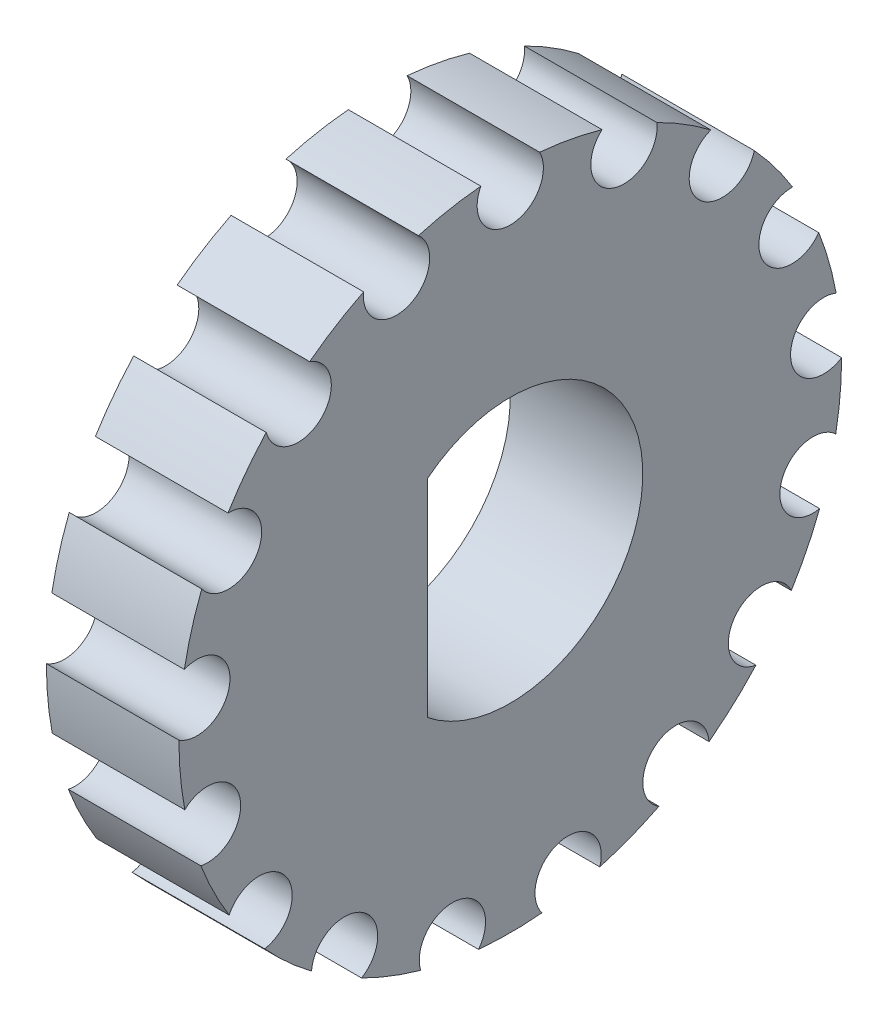
ISO-10303-21;
HEADER;
FILE_DESCRIPTION(('STEP AP214'),'2;1');
FILE_NAME('part.step','',(''),(''),'','','');
FILE_SCHEMA(('AUTOMOTIVE_DESIGN { 1 0 10303 214 1 1 1 1 }'));
ENDSEC;
DATA;
#1=APPLICATION_CONTEXT('core data for automotive mechanical design processes');
#2=APPLICATION_PROTOCOL_DEFINITION('international standard','automotive_design',2000,#1);
#3=PRODUCT_CONTEXT('',#1,'mechanical');
#4=PRODUCT('Part','Part','',(#3));
#5=PRODUCT_RELATED_PRODUCT_CATEGORY('part','',(#4));
#6=PRODUCT_DEFINITION_FORMATION('','',#4);
#7=PRODUCT_DEFINITION_CONTEXT('part definition',#1,'design');
#8=PRODUCT_DEFINITION('design','',#6,#7);
#9=PRODUCT_DEFINITION_SHAPE('','',#8);
#10=(LENGTH_UNIT() NAMED_UNIT(*) SI_UNIT(.MILLI.,.METRE.));
#11=(NAMED_UNIT(*) PLANE_ANGLE_UNIT() SI_UNIT($,.RADIAN.));
#12=(NAMED_UNIT(*) SI_UNIT($,.STERADIAN.) SOLID_ANGLE_UNIT());
#13=UNCERTAINTY_MEASURE_WITH_UNIT(LENGTH_MEASURE(1.E-05),#10,'distance_accuracy_value','');
#14=(GEOMETRIC_REPRESENTATION_CONTEXT(3) GLOBAL_UNCERTAINTY_ASSIGNED_CONTEXT((#13)) GLOBAL_UNIT_ASSIGNED_CONTEXT((#10,
#11,#12)) REPRESENTATION_CONTEXT('',''));
#15=CARTESIAN_POINT('',(0.,0.,0.));
#16=DIRECTION('',(0.,0.,1.));
#17=DIRECTION('',(1.,0.,0.));
#18=AXIS2_PLACEMENT_3D('',#15,#16,#17);
#19=CARTESIAN_POINT('',(4.,0.,0.));
#20=DIRECTION('',(-1.,0.,0.));
#21=DIRECTION('',(0.,0.,1.));
#22=AXIS2_PLACEMENT_3D('',#19,#20,#21);
#23=CYLINDRICAL_SURFACE('',#22,10.);
#24=CARTESIAN_POINT('',(0.,0.,0.));
#25=DIRECTION('',(1.,0.,0.));
#26=DIRECTION('',(0.,0.,-1.));
#27=AXIS2_PLACEMENT_3D('',#24,#25,#26);
#28=CIRCLE('',#27,10.);
#29=CARTESIAN_POINT('',(0.,7.95892104546946,-6.05438484009592));
#30=VERTEX_POINT('',#29);
#31=CARTESIAN_POINT('',(0.,8.96725944115314,-4.4258624148351));
#32=VERTEX_POINT('',#31);
#33=EDGE_CURVE('E493',#30,#32,#28,.T.);
#34=ORIENTED_EDGE('',*,*,#33,.T.);
#35=DIRECTION('',(-1.,0.,0.));
#36=VECTOR('',#35,1.);
#37=CARTESIAN_POINT('',(2.,8.96725944115314,-4.42586241483511));
#38=LINE('',#37,#36);
#39=CARTESIAN_POINT('',(4.,8.96725944115314,-4.42586241483511));
#40=VERTEX_POINT('',#39);
#41=EDGE_CURVE('E291',#32,#40,#38,.F.);
#42=ORIENTED_EDGE('',*,*,#41,.T.);
#43=CARTESIAN_POINT('',(4.,0.,0.));
#44=DIRECTION('',(1.,0.,0.));
#45=DIRECTION('',(0.,0.,-1.));
#46=AXIS2_PLACEMENT_3D('',#43,#44,#45);
#47=CIRCLE('',#46,10.);
#48=CARTESIAN_POINT('',(4.,7.95892104546946,-6.05438484009592));
#49=VERTEX_POINT('',#48);
#50=EDGE_CURVE('E517',#49,#40,#47,.T.);
#51=ORIENTED_EDGE('',*,*,#50,.F.);
#52=DIRECTION('',(-1.,0.,0.));
#53=VECTOR('',#52,1.);
#54=CARTESIAN_POINT('',(2.,7.95892104546946,-6.05438484009592));
#55=LINE('',#54,#53);
#56=EDGE_CURVE('E297',#49,#30,#55,.T.);
#57=ORIENTED_EDGE('',*,*,#56,.T.);
#58=EDGE_LOOP('',(#34,#42,#51,#57));
#59=FACE_BOUND('',#58,.T.);
#60=ADVANCED_FACE('F35',(#59),#23,.T.);
#61=CARTESIAN_POINT('',(0.,5.23437678354762,-8.52063962903358));
#62=VERTEX_POINT('',#61);
#63=CARTESIAN_POINT('',(0.,6.76291448968866,-7.36634153465336));
#64=VERTEX_POINT('',#63);
#65=EDGE_CURVE('E491',#62,#64,#28,.T.);
#66=ORIENTED_EDGE('',*,*,#65,.T.);
#67=DIRECTION('',(-1.,0.,0.));
#68=VECTOR('',#67,1.);
#69=CARTESIAN_POINT('',(2.,6.76291448968866,-7.36634153465336));
#70=LINE('',#69,#68);
#71=CARTESIAN_POINT('',(4.,6.76291448968866,-7.36634153465336));
#72=VERTEX_POINT('',#71);
#73=EDGE_CURVE('E300',#64,#72,#70,.F.);
#74=ORIENTED_EDGE('',*,*,#73,.T.);
#75=CARTESIAN_POINT('',(4.,5.23437678354762,-8.52063962903358));
#76=VERTEX_POINT('',#75);
#77=EDGE_CURVE('E518',#76,#72,#47,.T.);
#78=ORIENTED_EDGE('',*,*,#77,.F.);
#79=DIRECTION('',(-1.,0.,0.));
#80=VECTOR('',#79,1.);
#81=CARTESIAN_POINT('',(2.,5.23437678354762,-8.52063962903358));
#82=LINE('',#81,#80);
#83=EDGE_CURVE('E306',#76,#62,#82,.T.);
#84=ORIENTED_EDGE('',*,*,#83,.T.);
#85=EDGE_LOOP('',(#66,#74,#78,#84));
#86=FACE_BOUND('',#85,.T.);
#87=ADVANCED_FACE('F496',(#86),#23,.T.);
#88=CARTESIAN_POINT('',(0.,1.80290093232468,-9.83613482157615));
#89=VERTEX_POINT('',#88);
#90=CARTESIAN_POINT('',(0.,3.64520046178807,-9.31195541190893));
#91=VERTEX_POINT('',#90);
#92=EDGE_CURVE('E499',#89,#91,#28,.T.);
#93=ORIENTED_EDGE('',*,*,#92,.T.);
#94=DIRECTION('',(-1.,0.,0.));
#95=VECTOR('',#94,1.);
#96=CARTESIAN_POINT('',(2.,3.64520046178807,-9.31195541190893));
#97=LINE('',#96,#95);
#98=CARTESIAN_POINT('',(4.,3.64520046178807,-9.31195541190893));
#99=VERTEX_POINT('',#98);
#100=EDGE_CURVE('E309',#91,#99,#97,.F.);
#101=ORIENTED_EDGE('',*,*,#100,.T.);
#102=CARTESIAN_POINT('',(4.,1.80290093232468,-9.83613482157615));
#103=VERTEX_POINT('',#102);
#104=EDGE_CURVE('E520',#103,#99,#47,.T.);
#105=ORIENTED_EDGE('',*,*,#104,.F.);
#106=DIRECTION('',(-1.,0.,0.));
#107=VECTOR('',#106,1.);
#108=CARTESIAN_POINT('',(2.,1.80290093232468,-9.83613482157615));
#109=LINE('',#108,#107);
#110=EDGE_CURVE('E315',#103,#89,#109,.T.);
#111=ORIENTED_EDGE('',*,*,#110,.T.);
#112=EDGE_LOOP('',(#93,#101,#105,#111));
#113=FACE_BOUND('',#112,.T.);
#114=ADVANCED_FACE('F613',(#113),#23,.T.);
#115=CARTESIAN_POINT('',(0.,-1.87206668002759,-9.82320550256028));
#116=VERTEX_POINT('',#115);
#117=CARTESIAN_POINT('',(0.,0.0351819127693295,-9.99993811145919));
#118=VERTEX_POINT('',#117);
#119=EDGE_CURVE('E501',#116,#118,#28,.T.);
#120=ORIENTED_EDGE('',*,*,#119,.T.);
#121=DIRECTION('',(-1.,0.,0.));
#122=VECTOR('',#121,1.);
#123=CARTESIAN_POINT('',(2.,0.0351819127693285,-9.99993811145919));
#124=LINE('',#123,#122);
#125=CARTESIAN_POINT('',(4.,0.0351819127693281,-9.99993811145919));
#126=VERTEX_POINT('',#125);
#127=EDGE_CURVE('E318',#118,#126,#124,.F.);
#128=ORIENTED_EDGE('',*,*,#127,.T.);
#129=CARTESIAN_POINT('',(4.,-1.87206668002759,-9.82320550256028));
#130=VERTEX_POINT('',#129);
#131=EDGE_CURVE('E522',#130,#126,#47,.T.);
#132=ORIENTED_EDGE('',*,*,#131,.F.);
#133=DIRECTION('',(-1.,0.,0.));
#134=VECTOR('',#133,1.);
#135=CARTESIAN_POINT('',(2.,-1.87206668002759,-9.82320550256028));
#136=LINE('',#135,#134);
#137=EDGE_CURVE('E324',#130,#116,#136,.T.);
#138=ORIENTED_EDGE('',*,*,#137,.T.);
#139=EDGE_LOOP('',(#120,#128,#132,#138));
#140=FACE_BOUND('',#139,.T.);
#141=ADVANCED_FACE('F608',(#140),#23,.T.);
#142=CARTESIAN_POINT('',(0.,-5.29420131376252,-8.48359784816295));
#143=VERTEX_POINT('',#142);
#144=CARTESIAN_POINT('',(0.,-3.57958814851872,-9.33737375748579));
#145=VERTEX_POINT('',#144);
#146=EDGE_CURVE('E599',#143,#145,#28,.T.);
#147=ORIENTED_EDGE('',*,*,#146,.T.);
#148=DIRECTION('',(-1.,0.,0.));
#149=VECTOR('',#148,1.);
#150=CARTESIAN_POINT('',(2.,-3.57958814851872,-9.33737375748579));
#151=LINE('',#150,#149);
#152=CARTESIAN_POINT('',(4.,-3.57958814851872,-9.33737375748579));
#153=VERTEX_POINT('',#152);
#154=EDGE_CURVE('E327',#145,#153,#151,.F.);
#155=ORIENTED_EDGE('',*,*,#154,.T.);
#156=CARTESIAN_POINT('',(4.,-5.29420131376252,-8.48359784816295));
#157=VERTEX_POINT('',#156);
#158=EDGE_CURVE('E525',#157,#153,#47,.T.);
#159=ORIENTED_EDGE('',*,*,#158,.F.);
#160=DIRECTION('',(-1.,0.,0.));
#161=VECTOR('',#160,1.);
#162=CARTESIAN_POINT('',(2.,-5.29420131376252,-8.48359784816295));
#163=LINE('',#162,#161);
#164=EDGE_CURVE('E333',#157,#143,#163,.T.);
#165=ORIENTED_EDGE('',*,*,#164,.T.);
#166=EDGE_LOOP('',(#147,#155,#159,#165));
#167=FACE_BOUND('',#166,.T.);
#168=ADVANCED_FACE('F677',(#167),#23,.T.);
#169=CARTESIAN_POINT('',(0.,-8.00132472389165,-5.99823329513283));
#170=VERTEX_POINT('',#169);
#171=CARTESIAN_POINT('',(0.,-6.71091499516615,-7.4137453373888));
#172=VERTEX_POINT('',#171);
#173=EDGE_CURVE('E595',#170,#172,#28,.T.);
#174=ORIENTED_EDGE('',*,*,#173,.T.);
#175=DIRECTION('',(-1.,0.,0.));
#176=VECTOR('',#175,1.);
#177=CARTESIAN_POINT('',(2.,-6.71091499516614,-7.4137453373888));
#178=LINE('',#177,#176);
#179=CARTESIAN_POINT('',(4.,-6.71091499516614,-7.4137453373888));
#180=VERTEX_POINT('',#179);
#181=EDGE_CURVE('E336',#172,#180,#178,.F.);
#182=ORIENTED_EDGE('',*,*,#181,.T.);
#183=CARTESIAN_POINT('',(4.,-8.00132472389165,-5.99823329513283));
#184=VERTEX_POINT('',#183);
#185=EDGE_CURVE('E528',#184,#180,#47,.T.);
#186=ORIENTED_EDGE('',*,*,#185,.F.);
#187=DIRECTION('',(-1.,0.,0.));
#188=VECTOR('',#187,1.);
#189=CARTESIAN_POINT('',(2.,-8.00132472389165,-5.99823329513283));
#190=LINE('',#189,#188);
#191=EDGE_CURVE('E342',#184,#170,#190,.T.);
#192=ORIENTED_EDGE('',*,*,#191,.T.);
#193=EDGE_LOOP('',(#174,#182,#186,#192));
#194=FACE_BOUND('',#193,.T.);
#195=ADVANCED_FACE('F673',(#194),#23,.T.);
#196=CARTESIAN_POINT('',(0.,-9.62782489318844,-2.70277409823701));
#197=VERTEX_POINT('',#196);
#198=CARTESIAN_POINT('',(0.,-8.9358955852518,-4.48884952849585));
#199=VERTEX_POINT('',#198);
#200=EDGE_CURVE('E591',#197,#199,#28,.T.);
#201=ORIENTED_EDGE('',*,*,#200,.T.);
#202=DIRECTION('',(-1.,0.,0.));
#203=VECTOR('',#202,1.);
#204=CARTESIAN_POINT('',(2.,-8.93589558525179,-4.48884952849585));
#205=LINE('',#204,#203);
#206=CARTESIAN_POINT('',(4.,-8.93589558525179,-4.48884952849585));
#207=VERTEX_POINT('',#206);
#208=EDGE_CURVE('E345',#199,#207,#205,.F.);
#209=ORIENTED_EDGE('',*,*,#208,.T.);
#210=CARTESIAN_POINT('',(4.,-9.62782489318844,-2.70277409823701));
#211=VERTEX_POINT('',#210);
#212=EDGE_CURVE('E531',#211,#207,#47,.T.);
#213=ORIENTED_EDGE('',*,*,#212,.F.);
#214=DIRECTION('',(-1.,0.,0.));
#215=VECTOR('',#214,1.);
#216=CARTESIAN_POINT('',(2.,-9.62782489318844,-2.70277409823701));
#217=LINE('',#216,#215);
#218=EDGE_CURVE('E351',#211,#197,#217,.T.);
#219=ORIENTED_EDGE('',*,*,#218,.T.);
#220=EDGE_LOOP('',(#201,#209,#213,#219));
#221=FACE_BOUND('',#220,.T.);
#222=ADVANCED_FACE('F669',(#221),#23,.T.);
#223=CARTESIAN_POINT('',(0.,-9.95403396104082,0.957709717213996));
#224=VERTEX_POINT('',#223);
#225=CARTESIAN_POINT('',(0.,-9.95403396104161,-0.957709717205718));
#226=VERTEX_POINT('',#225);
#227=EDGE_CURVE('E587',#224,#226,#28,.T.);
#228=ORIENTED_EDGE('',*,*,#227,.T.);
#229=DIRECTION('',(-1.,0.,0.));
#230=VECTOR('',#229,1.);
#231=CARTESIAN_POINT('',(2.,-9.95403396104161,-0.957709717205721));
#232=LINE('',#231,#230);
#233=CARTESIAN_POINT('',(4.,-9.95403396104161,-0.957709717205722));
#234=VERTEX_POINT('',#233);
#235=EDGE_CURVE('E354',#226,#234,#232,.F.);
#236=ORIENTED_EDGE('',*,*,#235,.T.);
#237=CARTESIAN_POINT('',(4.,-9.95403396104082,0.957709717213996));
#238=VERTEX_POINT('',#237);
#239=EDGE_CURVE('E534',#238,#234,#47,.T.);
#240=ORIENTED_EDGE('',*,*,#239,.F.);
#241=DIRECTION('',(-1.,0.,0.));
#242=VECTOR('',#241,1.);
#243=CARTESIAN_POINT('',(2.,-9.95403396104082,0.957709717213996));
#244=LINE('',#243,#242);
#245=EDGE_CURVE('E360',#238,#224,#244,.T.);
#246=ORIENTED_EDGE('',*,*,#245,.T.);
#247=EDGE_LOOP('',(#228,#236,#240,#246));
#248=FACE_BOUND('',#247,.T.);
#249=ADVANCED_FACE('F665',(#248),#23,.T.);
#250=CARTESIAN_POINT('',(0.,-8.93589558524844,4.48884952850254));
#251=VERTEX_POINT('',#250);
#252=CARTESIAN_POINT('',(0.,-9.62782489318613,2.70277409824527));
#253=VERTEX_POINT('',#252);
#254=EDGE_CURVE('E583',#251,#253,#28,.T.);
#255=ORIENTED_EDGE('',*,*,#254,.T.);
#256=DIRECTION('',(-1.,0.,0.));
#257=VECTOR('',#256,1.);
#258=CARTESIAN_POINT('',(2.,-9.62782489318613,2.70277409824527));
#259=LINE('',#258,#257);
#260=CARTESIAN_POINT('',(4.,-9.62782489318613,2.70277409824527));
#261=VERTEX_POINT('',#260);
#262=EDGE_CURVE('E363',#253,#261,#259,.F.);
#263=ORIENTED_EDGE('',*,*,#262,.T.);
#264=CARTESIAN_POINT('',(4.,-8.93589558524844,4.48884952850254));
#265=VERTEX_POINT('',#264);
#266=EDGE_CURVE('E537',#265,#261,#47,.T.);
#267=ORIENTED_EDGE('',*,*,#266,.F.);
#268=DIRECTION('',(-1.,0.,0.));
#269=VECTOR('',#268,1.);
#270=CARTESIAN_POINT('',(2.,-8.93589558524844,4.48884952850254));
#271=LINE('',#270,#269);
#272=EDGE_CURVE('E370',#265,#251,#271,.T.);
#273=ORIENTED_EDGE('',*,*,#272,.T.);
#274=EDGE_LOOP('',(#255,#263,#267,#273));
#275=FACE_BOUND('',#274,.T.);
#276=ADVANCED_FACE('F661',(#275),#23,.T.);
#277=CARTESIAN_POINT('',(0.,-6.71091499516152,7.41374533739299));
#278=VERTEX_POINT('',#277);
#279=CARTESIAN_POINT('',(0.,-8.00132472388669,5.99823329513946));
#280=VERTEX_POINT('',#279);
#281=EDGE_CURVE('E579',#278,#280,#28,.T.);
#282=ORIENTED_EDGE('',*,*,#281,.T.);
#283=DIRECTION('',(-1.,0.,0.));
#284=VECTOR('',#283,1.);
#285=CARTESIAN_POINT('',(2.,-8.00132472388669,5.99823329513946));
#286=LINE('',#285,#284);
#287=CARTESIAN_POINT('',(4.,-8.00132472388669,5.99823329513946));
#288=VERTEX_POINT('',#287);
#289=EDGE_CURVE('E374',#280,#288,#286,.F.);
#290=ORIENTED_EDGE('',*,*,#289,.T.);
#291=CARTESIAN_POINT('',(4.,-6.71091499516152,7.41374533739299));
#292=VERTEX_POINT('',#291);
#293=EDGE_CURVE('E540',#292,#288,#47,.T.);
#294=ORIENTED_EDGE('',*,*,#293,.F.);
#295=DIRECTION('',(-1.,0.,0.));
#296=VECTOR('',#295,1.);
#297=CARTESIAN_POINT('',(2.,-6.71091499516152,7.41374533739299));
#298=LINE('',#297,#296);
#299=EDGE_CURVE('E381',#292,#278,#298,.T.);
#300=ORIENTED_EDGE('',*,*,#299,.T.);
#301=EDGE_LOOP('',(#282,#290,#294,#300));
#302=FACE_BOUND('',#301,.T.);
#303=ADVANCED_FACE('F657',(#302),#23,.T.);
#304=CARTESIAN_POINT('',(0.,-3.57958814851431,9.33737375748749));
#305=VERTEX_POINT('',#304);
#306=CARTESIAN_POINT('',(0.,-5.29420131375623,8.48359784816689));
#307=VERTEX_POINT('',#306);
#308=EDGE_CURVE('E575',#305,#307,#28,.T.);
#309=ORIENTED_EDGE('',*,*,#308,.T.);
#310=DIRECTION('',(-1.,0.,0.));
#311=VECTOR('',#310,1.);
#312=CARTESIAN_POINT('',(2.,-5.29420131375623,8.48359784816689));
#313=LINE('',#312,#311);
#314=CARTESIAN_POINT('',(4.,-5.29420131375623,8.48359784816689));
#315=VERTEX_POINT('',#314);
#316=EDGE_CURVE('E385',#307,#315,#313,.F.);
#317=ORIENTED_EDGE('',*,*,#316,.T.);
#318=CARTESIAN_POINT('',(4.,-3.57958814851431,9.33737375748749));
#319=VERTEX_POINT('',#318);
#320=EDGE_CURVE('E543',#319,#315,#47,.T.);
#321=ORIENTED_EDGE('',*,*,#320,.F.);
#322=DIRECTION('',(-1.,0.,0.));
#323=VECTOR('',#322,1.);
#324=CARTESIAN_POINT('',(2.,-3.57958814851431,9.33737375748749));
#325=LINE('',#324,#323);
#326=EDGE_CURVE('E392',#319,#305,#325,.T.);
#327=ORIENTED_EDGE('',*,*,#326,.T.);
#328=EDGE_LOOP('',(#309,#317,#321,#327));
#329=FACE_BOUND('',#328,.T.);
#330=ADVANCED_FACE('F653',(#329),#23,.T.);
#331=CARTESIAN_POINT('',(0.,0.0351819127724796,9.99993811145917));
#332=VERTEX_POINT('',#331);
#333=CARTESIAN_POINT('',(0.,-1.87206668002157,9.82320550256143));
#334=VERTEX_POINT('',#333);
#335=EDGE_CURVE('E572',#332,#334,#28,.T.);
#336=ORIENTED_EDGE('',*,*,#335,.T.);
#337=DIRECTION('',(-1.,0.,0.));
#338=VECTOR('',#337,1.);
#339=CARTESIAN_POINT('',(2.,-1.87206668002156,9.82320550256143));
#340=LINE('',#339,#338);
#341=CARTESIAN_POINT('',(4.,-1.87206668002156,9.82320550256143));
#342=VERTEX_POINT('',#341);
#343=EDGE_CURVE('E396',#334,#342,#340,.F.);
#344=ORIENTED_EDGE('',*,*,#343,.T.);
#345=CARTESIAN_POINT('',(4.,0.0351819127724796,9.99993811145917));
#346=VERTEX_POINT('',#345);
#347=EDGE_CURVE('E546',#346,#342,#47,.T.);
#348=ORIENTED_EDGE('',*,*,#347,.F.);
#349=DIRECTION('',(-1.,0.,0.));
#350=VECTOR('',#349,1.);
#351=CARTESIAN_POINT('',(2.,0.0351819127724796,9.99993811145917));
#352=LINE('',#351,#350);
#353=EDGE_CURVE('E403',#346,#332,#352,.T.);
#354=ORIENTED_EDGE('',*,*,#353,.T.);
#355=EDGE_LOOP('',(#336,#344,#348,#354));
#356=FACE_BOUND('',#355,.T.);
#357=ADVANCED_FACE('F649',(#356),#23,.T.);
#358=CARTESIAN_POINT('',(0.,3.64520046178969,9.3119554119083));
#359=VERTEX_POINT('',#358);
#360=CARTESIAN_POINT('',(0.,1.8029009323292,9.83613482157532));
#361=VERTEX_POINT('',#360);
#362=EDGE_CURVE('E570',#359,#361,#28,.T.);
#363=ORIENTED_EDGE('',*,*,#362,.T.);
#364=DIRECTION('',(-1.,0.,0.));
#365=VECTOR('',#364,1.);
#366=CARTESIAN_POINT('',(2.,1.8029009323292,9.83613482157532));
#367=LINE('',#366,#365);
#368=CARTESIAN_POINT('',(4.,1.8029009323292,9.83613482157532));
#369=VERTEX_POINT('',#368);
#370=EDGE_CURVE('E407',#361,#369,#367,.F.);
#371=ORIENTED_EDGE('',*,*,#370,.T.);
#372=CARTESIAN_POINT('',(4.,3.64520046178969,9.3119554119083));
#373=VERTEX_POINT('',#372);
#374=EDGE_CURVE('E549',#373,#369,#47,.T.);
#375=ORIENTED_EDGE('',*,*,#374,.F.);
#376=DIRECTION('',(-1.,0.,0.));
#377=VECTOR('',#376,1.);
#378=CARTESIAN_POINT('',(2.,3.64520046178969,9.3119554119083));
#379=LINE('',#378,#377);
#380=EDGE_CURVE('E414',#373,#359,#379,.T.);
#381=ORIENTED_EDGE('',*,*,#380,.T.);
#382=EDGE_LOOP('',(#363,#371,#375,#381));
#383=FACE_BOUND('',#382,.T.);
#384=ADVANCED_FACE('F645',(#383),#23,.T.);
#385=CARTESIAN_POINT('',(0.,6.76291448968916,7.3663415346529));
#386=VERTEX_POINT('',#385);
#387=CARTESIAN_POINT('',(0.,5.23437678355017,8.52063962903202));
#388=VERTEX_POINT('',#387);
#389=EDGE_CURVE('E567',#386,#388,#28,.T.);
#390=ORIENTED_EDGE('',*,*,#389,.T.);
#391=DIRECTION('',(-1.,0.,0.));
#392=VECTOR('',#391,1.);
#393=CARTESIAN_POINT('',(2.,5.23437678355017,8.52063962903202));
#394=LINE('',#393,#392);
#395=CARTESIAN_POINT('',(4.,5.23437678355017,8.52063962903202));
#396=VERTEX_POINT('',#395);
#397=EDGE_CURVE('E418',#388,#396,#394,.F.);
#398=ORIENTED_EDGE('',*,*,#397,.T.);
#399=CARTESIAN_POINT('',(4.,6.76291448968916,7.3663415346529));
#400=VERTEX_POINT('',#399);
#401=EDGE_CURVE('E552',#400,#396,#47,.T.);
#402=ORIENTED_EDGE('',*,*,#401,.F.);
#403=DIRECTION('',(-1.,0.,0.));
#404=VECTOR('',#403,1.);
#405=CARTESIAN_POINT('',(2.,6.76291448968916,7.3663415346529));
#406=LINE('',#405,#404);
#407=EDGE_CURVE('E425',#400,#386,#406,.T.);
#408=ORIENTED_EDGE('',*,*,#407,.T.);
#409=EDGE_LOOP('',(#390,#398,#402,#408));
#410=FACE_BOUND('',#409,.T.);
#411=ADVANCED_FACE('F641',(#410),#23,.T.);
#412=CARTESIAN_POINT('',(0.,8.96725944115319,4.42586241483499));
#413=VERTEX_POINT('',#412);
#414=CARTESIAN_POINT('',(0.,7.95892104547039,6.0543848400947));
#415=VERTEX_POINT('',#414);
#416=EDGE_CURVE('E460',#413,#415,#28,.T.);
#417=ORIENTED_EDGE('',*,*,#416,.T.);
#418=DIRECTION('',(-1.,0.,0.));
#419=VECTOR('',#418,1.);
#420=CARTESIAN_POINT('',(2.,7.95892104547039,6.0543848400947));
#421=LINE('',#420,#419);
#422=CARTESIAN_POINT('',(4.,7.95892104547039,6.0543848400947));
#423=VERTEX_POINT('',#422);
#424=EDGE_CURVE('E429',#415,#423,#421,.F.);
#425=ORIENTED_EDGE('',*,*,#424,.T.);
#426=CARTESIAN_POINT('',(4.,8.96725944115319,4.42586241483499));
#427=VERTEX_POINT('',#426);
#428=EDGE_CURVE('E455',#427,#423,#47,.T.);
#429=ORIENTED_EDGE('',*,*,#428,.F.);
#430=DIRECTION('',(-1.,0.,0.));
#431=VECTOR('',#430,1.);
#432=CARTESIAN_POINT('',(2.,8.96725944115319,4.42586241483499));
#433=LINE('',#432,#431);
#434=EDGE_CURVE('E435',#427,#413,#433,.T.);
#435=ORIENTED_EDGE('',*,*,#434,.T.);
#436=EDGE_LOOP('',(#417,#425,#429,#435));
#437=FACE_BOUND('',#436,.T.);
#438=ADVANCED_FACE('F560',(#437),#23,.T.);
#439=CARTESIAN_POINT('',(0.,9.96052631578948,0.887646051343309));
#440=VERTEX_POINT('',#439);
#441=CARTESIAN_POINT('',(0.,9.60856891829679,2.77045182999827));
#442=VERTEX_POINT('',#441);
#443=EDGE_CURVE('E457',#440,#442,#28,.T.);
#444=ORIENTED_EDGE('',*,*,#443,.T.);
#445=DIRECTION('',(-1.,0.,0.));
#446=VECTOR('',#445,1.);
#447=CARTESIAN_POINT('',(2.,9.6085689182968,2.77045182999827));
#448=LINE('',#447,#446);
#449=CARTESIAN_POINT('',(4.,9.6085689182968,2.77045182999827));
#450=VERTEX_POINT('',#449);
#451=EDGE_CURVE('E438',#442,#450,#448,.F.);
#452=ORIENTED_EDGE('',*,*,#451,.T.);
#453=CARTESIAN_POINT('',(4.,9.96052631578948,0.887646051343309));
#454=VERTEX_POINT('',#453);
#455=EDGE_CURVE('E451',#454,#450,#47,.T.);
#456=ORIENTED_EDGE('',*,*,#455,.F.);
#457=DIRECTION('',(-1.,0.,0.));
#458=VECTOR('',#457,1.);
#459=CARTESIAN_POINT('',(2.,9.96052631578948,0.887646051343309));
#460=LINE('',#459,#458);
#461=EDGE_CURVE('E444',#454,#440,#460,.T.);
#462=ORIENTED_EDGE('',*,*,#461,.T.);
#463=EDGE_LOOP('',(#444,#452,#456,#462));
#464=FACE_BOUND('',#463,.T.);
#465=ADVANCED_FACE('F512',(#464),#23,.T.);
#466=CARTESIAN_POINT('',(4.,9.60856891829668,-2.7704518299987));
#467=VERTEX_POINT('',#466);
#468=CARTESIAN_POINT('',(4.,9.96052631578948,-0.887646051343309));
#469=VERTEX_POINT('',#468);
#470=EDGE_CURVE('E456',#467,#469,#47,.T.);
#471=ORIENTED_EDGE('',*,*,#470,.F.);
#472=DIRECTION('',(-1.,0.,0.));
#473=VECTOR('',#472,1.);
#474=CARTESIAN_POINT('',(2.,9.60856891829668,-2.7704518299987));
#475=LINE('',#474,#473);
#476=CARTESIAN_POINT('',(0.,9.60856891829668,-2.7704518299987));
#477=VERTEX_POINT('',#476);
#478=EDGE_CURVE('E288',#467,#477,#475,.T.);
#479=ORIENTED_EDGE('',*,*,#478,.T.);
#480=CARTESIAN_POINT('',(0.,9.96052631578948,-0.887646051343298));
#481=VERTEX_POINT('',#480);
#482=EDGE_CURVE('E450',#477,#481,#28,.T.);
#483=ORIENTED_EDGE('',*,*,#482,.T.);
#484=DIRECTION('',(-1.,0.,0.));
#485=VECTOR('',#484,1.);
#486=CARTESIAN_POINT('',(2.,9.96052631578948,-0.887646051343309));
#487=LINE('',#486,#485);
#488=EDGE_CURVE('E447',#481,#469,#487,.F.);
#489=ORIENTED_EDGE('',*,*,#488,.T.);
#490=EDGE_LOOP('',(#471,#479,#483,#489));
#491=FACE_BOUND('',#490,.T.);
#492=ADVANCED_FACE('F37',(#491),#23,.T.);
#493=CARTESIAN_POINT('',(4.,0.,0.));
#494=DIRECTION('',(1.,0.,0.));
#495=DIRECTION('',(0.,0.,-1.));
#496=AXIS2_PLACEMENT_3D('',#493,#494,#495);
#497=PLANE('',#496);
#498=CARTESIAN_POINT('',(4.,0.,0.));
#499=DIRECTION('',(1.,0.,0.));
#500=DIRECTION('',(0.,0.,-1.));
#501=AXIS2_PLACEMENT_3D('',#498,#499,#500);
#502=CIRCLE('',#501,4.);
#503=CARTESIAN_POINT('',(4.,-3.1224989991992,2.5));
#504=VERTEX_POINT('',#503);
#505=CARTESIAN_POINT('',(4.,3.1224989991992,2.5));
#506=VERTEX_POINT('',#505);
#507=EDGE_CURVE('E50',#504,#506,#502,.T.);
#508=ORIENTED_EDGE('',*,*,#507,.F.);
#509=DIRECTION('',(0.,-1.,0.));
#510=VECTOR('',#509,1.);
#511=CARTESIAN_POINT('',(4.,3.1224989991992,2.5));
#512=LINE('',#511,#510);
#513=EDGE_CURVE('E279',#506,#504,#512,.T.);
#514=ORIENTED_EDGE('',*,*,#513,.F.);
#515=EDGE_LOOP('',(#508,#514));
#516=FACE_BOUND('',#515,.T.);
#517=CARTESIAN_POINT('',(4.,8.85848617934065,-3.43179582877782));
#518=DIRECTION('',(-1.,0.,0.));
#519=DIRECTION('',(0.,0.,1.));
#520=AXIS2_PLACEMENT_3D('',#517,#518,#519);
#521=CIRCLE('',#520,1.00000000000047);
#522=EDGE_CURVE('E284',#40,#467,#521,.T.);
#523=ORIENTED_EDGE('',*,*,#522,.T.);
#524=ORIENTED_EDGE('',*,*,#470,.T.);
#525=CARTESIAN_POINT('',(4.,9.5,0.));
#526=DIRECTION('',(-1.,0.,0.));
#527=DIRECTION('',(0.,0.,1.));
#528=AXIS2_PLACEMENT_3D('',#525,#526,#527);
#529=CIRCLE('',#528,1.);
#530=EDGE_CURVE('E441',#469,#454,#529,.T.);
#531=ORIENTED_EDGE('',*,*,#530,.T.);
#532=ORIENTED_EDGE('',*,*,#455,.T.);
#533=CARTESIAN_POINT('',(4.,8.85848617934211,3.43179582877809));
#534=DIRECTION('',(-1.,0.,0.));
#535=DIRECTION('',(0.,0.,1.));
#536=AXIS2_PLACEMENT_3D('',#533,#534,#535);
#537=CIRCLE('',#536,0.999999999999927);
#538=EDGE_CURVE('E432',#450,#427,#537,.T.);
#539=ORIENTED_EDGE('',*,*,#538,.T.);
#540=ORIENTED_EDGE('',*,*,#428,.T.);
#541=CARTESIAN_POINT('',(4.,7.02058471359763,6.40010861464282));
#542=DIRECTION('',(-1.,0.,0.));
#543=DIRECTION('',(0.,0.,1.));
#544=AXIS2_PLACEMENT_3D('',#541,#542,#543);
#545=CIRCLE('',#544,1.00000000000012);
#546=EDGE_CURVE('E422',#423,#400,#545,.T.);
#547=ORIENTED_EDGE('',*,*,#546,.T.);
#548=ORIENTED_EDGE('',*,*,#401,.T.);
#549=CARTESIAN_POINT('',(4.,4.23451437987893,8.50405126787421));
#550=DIRECTION('',(-1.,0.,0.));
#551=DIRECTION('',(0.,0.,1.));
#552=AXIS2_PLACEMENT_3D('',#549,#550,#551);
#553=CIRCLE('',#552,1.00000000000057);
#554=EDGE_CURVE('E411',#396,#373,#553,.T.);
#555=ORIENTED_EDGE('',*,*,#554,.T.);
#556=ORIENTED_EDGE('',*,*,#374,.T.);
#557=CARTESIAN_POINT('',(4.,0.876549414903384,9.45947467480467));
#558=DIRECTION('',(-1.,0.,0.));
#559=DIRECTION('',(0.,0.,1.));
#560=AXIS2_PLACEMENT_3D('',#557,#558,#559);
#561=CIRCLE('',#560,1.0000000000012);
#562=EDGE_CURVE('E400',#369,#346,#561,.T.);
#563=ORIENTED_EDGE('',*,*,#562,.T.);
#564=ORIENTED_EDGE('',*,*,#347,.T.);
#565=CARTESIAN_POINT('',(4.,-2.59979840568284,9.13734361014436));
#566=DIRECTION('',(-1.,0.,0.));
#567=DIRECTION('',(0.,0.,1.));
#568=AXIS2_PLACEMENT_3D('',#565,#566,#567);
#569=CIRCLE('',#568,1.00000000000193);
#570=EDGE_CURVE('E389',#342,#319,#569,.T.);
#571=ORIENTED_EDGE('',*,*,#570,.T.);
#572=ORIENTED_EDGE('',*,*,#320,.T.);
#573=CARTESIAN_POINT('',(4.,-5.72502904560132,7.58116365916552));
#574=DIRECTION('',(-1.,0.,0.));
#575=DIRECTION('',(0.,0.,1.));
#576=AXIS2_PLACEMENT_3D('',#573,#574,#575);
#577=CIRCLE('',#576,1.00000000000268);
#578=EDGE_CURVE('E378',#315,#292,#577,.T.);
#579=ORIENTED_EDGE('',*,*,#578,.T.);
#580=ORIENTED_EDGE('',*,*,#293,.T.);
#581=CARTESIAN_POINT('',(4.,-8.07706278943027,5.00110554733862));
#582=DIRECTION('',(-1.,0.,0.));
#583=DIRECTION('',(0.,0.,1.));
#584=AXIS2_PLACEMENT_3D('',#581,#582,#583);
#585=CIRCLE('',#584,1.00000000000332);
#586=EDGE_CURVE('E367',#288,#265,#585,.T.);
#587=ORIENTED_EDGE('',*,*,#586,.T.);
#588=ORIENTED_EDGE('',*,*,#266,.T.);
#589=CARTESIAN_POINT('',(4.,-9.3382444469967,1.74562041926143));
#590=DIRECTION('',(-1.,0.,0.));
#591=DIRECTION('',(0.,0.,1.));
#592=AXIS2_PLACEMENT_3D('',#589,#590,#591);
#593=CIRCLE('',#592,1.00000000000379);
#594=EDGE_CURVE('E357',#261,#238,#593,.T.);
#595=ORIENTED_EDGE('',*,*,#594,.T.);
#596=ORIENTED_EDGE('',*,*,#239,.T.);
#597=CARTESIAN_POINT('',(4.,-9.33824444699744,-1.7456204192534));
#598=DIRECTION('',(-1.,0.,0.));
#599=DIRECTION('',(0.,0.,1.));
#600=AXIS2_PLACEMENT_3D('',#597,#598,#599);
#601=CIRCLE('',#600,1.00000000000401);
#602=EDGE_CURVE('E348',#234,#211,#601,.T.);
#603=ORIENTED_EDGE('',*,*,#602,.T.);
#604=ORIENTED_EDGE('',*,*,#212,.T.);
#605=CARTESIAN_POINT('',(4.,-8.0770627894324,-5.00110554733114));
#606=DIRECTION('',(-1.,0.,0.));
#607=DIRECTION('',(0.,0.,1.));
#608=AXIS2_PLACEMENT_3D('',#605,#606,#607);
#609=CIRCLE('',#608,1.00000000000397);
#610=EDGE_CURVE('E339',#207,#184,#609,.T.);
#611=ORIENTED_EDGE('',*,*,#610,.T.);
#612=ORIENTED_EDGE('',*,*,#185,.T.);
#613=CARTESIAN_POINT('',(4.,-5.72502904560455,-7.58116365915903));
#614=DIRECTION('',(-1.,0.,0.));
#615=DIRECTION('',(0.,0.,1.));
#616=AXIS2_PLACEMENT_3D('',#613,#614,#615);
#617=CIRCLE('',#616,1.00000000000366);
#618=EDGE_CURVE('E330',#180,#157,#617,.T.);
#619=ORIENTED_EDGE('',*,*,#618,.T.);
#620=ORIENTED_EDGE('',*,*,#158,.T.);
#621=CARTESIAN_POINT('',(4.,-2.59979840568674,-9.1373436101392));
#622=DIRECTION('',(-1.,0.,0.));
#623=DIRECTION('',(0.,0.,1.));
#624=AXIS2_PLACEMENT_3D('',#621,#622,#623);
#625=CIRCLE('',#624,1.00000000000313);
#626=EDGE_CURVE('E321',#153,#130,#625,.T.);
#627=ORIENTED_EDGE('',*,*,#626,.T.);
#628=ORIENTED_EDGE('',*,*,#131,.T.);
#629=CARTESIAN_POINT('',(4.,0.87654941489935,-9.45947467480099));
#630=DIRECTION('',(-1.,0.,0.));
#631=DIRECTION('',(0.,0.,1.));
#632=AXIS2_PLACEMENT_3D('',#629,#630,#631);
#633=CIRCLE('',#632,1.00000000000245);
#634=EDGE_CURVE('E312',#126,#103,#633,.T.);
#635=ORIENTED_EDGE('',*,*,#634,.T.);
#636=ORIENTED_EDGE('',*,*,#104,.T.);
#637=CARTESIAN_POINT('',(4.,4.2345143798753,-8.50405126787197));
#638=DIRECTION('',(-1.,0.,0.));
#639=DIRECTION('',(0.,0.,1.));
#640=AXIS2_PLACEMENT_3D('',#637,#638,#639);
#641=CIRCLE('',#640,1.00000000000171);
#642=EDGE_CURVE('E303',#99,#76,#641,.T.);
#643=ORIENTED_EDGE('',*,*,#642,.T.);
#644=ORIENTED_EDGE('',*,*,#77,.T.);
#645=CARTESIAN_POINT('',(4.,7.0205847135949,-6.40010861464176));
#646=DIRECTION('',(-1.,0.,0.));
#647=DIRECTION('',(0.,0.,1.));
#648=AXIS2_PLACEMENT_3D('',#645,#646,#647);
#649=CIRCLE('',#648,1.00000000000102);
#650=EDGE_CURVE('E294',#72,#49,#649,.T.);
#651=ORIENTED_EDGE('',*,*,#650,.T.);
#652=ORIENTED_EDGE('',*,*,#50,.T.);
#653=EDGE_LOOP('',(#523,#524,#531,#532,#539,#540,#547,#548,#555,#556,#563,#564,#571,#572,#579,
#580,#587,#588,#595,#596,#603,#604,#611,#612,#619,#620,#627,#628,#635,#636,#643,#644,#651,#652));
#654=FACE_BOUND('',#653,.T.);
#655=ADVANCED_FACE('F515',(#516,#654),#497,.T.);
#656=CARTESIAN_POINT('',(0.,0.,0.));
#657=DIRECTION('',(1.,0.,0.));
#658=DIRECTION('',(0.,0.,-1.));
#659=AXIS2_PLACEMENT_3D('',#656,#657,#658);
#660=PLANE('',#659);
#661=DIRECTION('',(0.,-1.,0.));
#662=VECTOR('',#661,1.);
#663=CARTESIAN_POINT('',(0.,3.1224989991992,2.5));
#664=LINE('',#663,#662);
#665=CARTESIAN_POINT('',(0.,3.1224989991992,2.5));
#666=VERTEX_POINT('',#665);
#667=CARTESIAN_POINT('',(0.,-3.1224989991992,2.5));
#668=VERTEX_POINT('',#667);
#669=EDGE_CURVE('E271',#666,#668,#664,.T.);
#670=ORIENTED_EDGE('',*,*,#669,.T.);
#671=CARTESIAN_POINT('',(0.,0.,0.));
#672=DIRECTION('',(1.,0.,0.));
#673=DIRECTION('',(0.,0.,-1.));
#674=AXIS2_PLACEMENT_3D('',#671,#672,#673);
#675=CIRCLE('',#674,4.);
#676=EDGE_CURVE('E55',#668,#666,#675,.T.);
#677=ORIENTED_EDGE('',*,*,#676,.T.);
#678=EDGE_LOOP('',(#670,#677));
#679=FACE_BOUND('',#678,.T.);
#680=ORIENTED_EDGE('',*,*,#482,.F.);
#681=CARTESIAN_POINT('',(0.,8.85848617934065,-3.43179582877782));
#682=DIRECTION('',(1.,0.,0.));
#683=DIRECTION('',(0.,0.,-1.));
#684=AXIS2_PLACEMENT_3D('',#681,#682,#683);
#685=CIRCLE('',#684,1.00000000000047);
#686=EDGE_CURVE('E11',#477,#32,#685,.T.);
#687=ORIENTED_EDGE('',*,*,#686,.T.);
#688=ORIENTED_EDGE('',*,*,#33,.F.);
#689=CARTESIAN_POINT('',(0.,7.0205847135949,-6.40010861464176));
#690=DIRECTION('',(1.,0.,0.));
#691=DIRECTION('',(0.,0.,-1.));
#692=AXIS2_PLACEMENT_3D('',#689,#690,#691);
#693=CIRCLE('',#692,1.00000000000102);
#694=EDGE_CURVE('E43',#30,#64,#693,.T.);
#695=ORIENTED_EDGE('',*,*,#694,.T.);
#696=ORIENTED_EDGE('',*,*,#65,.F.);
#697=CARTESIAN_POINT('',(0.,4.2345143798753,-8.50405126787197));
#698=DIRECTION('',(1.,0.,0.));
#699=DIRECTION('',(0.,0.,-1.));
#700=AXIS2_PLACEMENT_3D('',#697,#698,#699);
#701=CIRCLE('',#700,1.00000000000171);
#702=EDGE_CURVE('E484',#62,#91,#701,.T.);
#703=ORIENTED_EDGE('',*,*,#702,.T.);
#704=ORIENTED_EDGE('',*,*,#92,.F.);
#705=CARTESIAN_POINT('',(0.,0.87654941489935,-9.45947467480099));
#706=DIRECTION('',(1.,0.,0.));
#707=DIRECTION('',(0.,0.,-1.));
#708=AXIS2_PLACEMENT_3D('',#705,#706,#707);
#709=CIRCLE('',#708,1.00000000000245);
#710=EDGE_CURVE('E481',#89,#118,#709,.T.);
#711=ORIENTED_EDGE('',*,*,#710,.T.);
#712=ORIENTED_EDGE('',*,*,#119,.F.);
#713=CARTESIAN_POINT('',(0.,-2.59979840568674,-9.1373436101392));
#714=DIRECTION('',(1.,0.,0.));
#715=DIRECTION('',(0.,0.,-1.));
#716=AXIS2_PLACEMENT_3D('',#713,#714,#715);
#717=CIRCLE('',#716,1.00000000000313);
#718=EDGE_CURVE('E478',#116,#145,#717,.T.);
#719=ORIENTED_EDGE('',*,*,#718,.T.);
#720=ORIENTED_EDGE('',*,*,#146,.F.);
#721=CARTESIAN_POINT('',(0.,-5.72502904560455,-7.58116365915903));
#722=DIRECTION('',(1.,0.,0.));
#723=DIRECTION('',(0.,0.,-1.));
#724=AXIS2_PLACEMENT_3D('',#721,#722,#723);
#725=CIRCLE('',#724,1.00000000000366);
#726=EDGE_CURVE('E475',#143,#172,#725,.T.);
#727=ORIENTED_EDGE('',*,*,#726,.T.);
#728=ORIENTED_EDGE('',*,*,#173,.F.);
#729=CARTESIAN_POINT('',(0.,-8.0770627894324,-5.00110554733114));
#730=DIRECTION('',(1.,0.,0.));
#731=DIRECTION('',(0.,0.,-1.));
#732=AXIS2_PLACEMENT_3D('',#729,#730,#731);
#733=CIRCLE('',#732,1.00000000000397);
#734=EDGE_CURVE('E472',#170,#199,#733,.T.);
#735=ORIENTED_EDGE('',*,*,#734,.T.);
#736=ORIENTED_EDGE('',*,*,#200,.F.);
#737=CARTESIAN_POINT('',(0.,-9.33824444699744,-1.7456204192534));
#738=DIRECTION('',(1.,0.,0.));
#739=DIRECTION('',(0.,0.,-1.));
#740=AXIS2_PLACEMENT_3D('',#737,#738,#739);
#741=CIRCLE('',#740,1.00000000000401);
#742=EDGE_CURVE('E469',#197,#226,#741,.T.);
#743=ORIENTED_EDGE('',*,*,#742,.T.);
#744=ORIENTED_EDGE('',*,*,#227,.F.);
#745=CARTESIAN_POINT('',(0.,-9.3382444469967,1.74562041926143));
#746=DIRECTION('',(1.,0.,0.));
#747=DIRECTION('',(0.,0.,-1.));
#748=AXIS2_PLACEMENT_3D('',#745,#746,#747);
#749=CIRCLE('',#748,1.00000000000379);
#750=EDGE_CURVE('E466',#224,#253,#749,.T.);
#751=ORIENTED_EDGE('',*,*,#750,.T.);
#752=ORIENTED_EDGE('',*,*,#254,.F.);
#753=CARTESIAN_POINT('',(0.,-8.07706278943027,5.00110554733862));
#754=DIRECTION('',(-1.,0.,0.));
#755=DIRECTION('',(0.,0.,1.));
#756=AXIS2_PLACEMENT_3D('',#753,#754,#755);
#757=CIRCLE('',#756,1.00000000000332);
#758=EDGE_CURVE('E366',#280,#251,#757,.T.);
#759=ORIENTED_EDGE('',*,*,#758,.F.);
#760=ORIENTED_EDGE('',*,*,#281,.F.);
#761=CARTESIAN_POINT('',(0.,-5.72502904560132,7.58116365916552));
#762=DIRECTION('',(-1.,0.,0.));
#763=DIRECTION('',(0.,0.,1.));
#764=AXIS2_PLACEMENT_3D('',#761,#762,#763);
#765=CIRCLE('',#764,1.00000000000268);
#766=EDGE_CURVE('E377',#307,#278,#765,.T.);
#767=ORIENTED_EDGE('',*,*,#766,.F.);
#768=ORIENTED_EDGE('',*,*,#308,.F.);
#769=CARTESIAN_POINT('',(0.,-2.59979840568284,9.13734361014436));
#770=DIRECTION('',(-1.,0.,0.));
#771=DIRECTION('',(0.,0.,1.));
#772=AXIS2_PLACEMENT_3D('',#769,#770,#771);
#773=CIRCLE('',#772,1.00000000000193);
#774=EDGE_CURVE('E388',#334,#305,#773,.T.);
#775=ORIENTED_EDGE('',*,*,#774,.F.);
#776=ORIENTED_EDGE('',*,*,#335,.F.);
#777=CARTESIAN_POINT('',(0.,0.876549414903384,9.45947467480467));
#778=DIRECTION('',(-1.,0.,0.));
#779=DIRECTION('',(0.,0.,1.));
#780=AXIS2_PLACEMENT_3D('',#777,#778,#779);
#781=CIRCLE('',#780,1.0000000000012);
#782=EDGE_CURVE('E399',#361,#332,#781,.T.);
#783=ORIENTED_EDGE('',*,*,#782,.F.);
#784=ORIENTED_EDGE('',*,*,#362,.F.);
#785=CARTESIAN_POINT('',(0.,4.23451437987893,8.50405126787421));
#786=DIRECTION('',(-1.,0.,0.));
#787=DIRECTION('',(0.,0.,1.));
#788=AXIS2_PLACEMENT_3D('',#785,#786,#787);
#789=CIRCLE('',#788,1.00000000000057);
#790=EDGE_CURVE('E410',#388,#359,#789,.T.);
#791=ORIENTED_EDGE('',*,*,#790,.F.);
#792=ORIENTED_EDGE('',*,*,#389,.F.);
#793=CARTESIAN_POINT('',(0.,7.02058471359763,6.40010861464282));
#794=DIRECTION('',(-1.,0.,0.));
#795=DIRECTION('',(0.,0.,1.));
#796=AXIS2_PLACEMENT_3D('',#793,#794,#795);
#797=CIRCLE('',#796,1.00000000000012);
#798=EDGE_CURVE('E421',#415,#386,#797,.T.);
#799=ORIENTED_EDGE('',*,*,#798,.F.);
#800=ORIENTED_EDGE('',*,*,#416,.F.);
#801=CARTESIAN_POINT('',(0.,8.85848617934211,3.43179582877809));
#802=DIRECTION('',(1.,0.,0.));
#803=DIRECTION('',(0.,0.,-1.));
#804=AXIS2_PLACEMENT_3D('',#801,#802,#803);
#805=CIRCLE('',#804,0.999999999999927);
#806=EDGE_CURVE('E463',#413,#442,#805,.T.);
#807=ORIENTED_EDGE('',*,*,#806,.T.);
#808=ORIENTED_EDGE('',*,*,#443,.F.);
#809=CARTESIAN_POINT('',(0.,9.5,0.));
#810=DIRECTION('',(1.,0.,0.));
#811=DIRECTION('',(0.,0.,-1.));
#812=AXIS2_PLACEMENT_3D('',#809,#810,#811);
#813=CIRCLE('',#812,1.);
#814=EDGE_CURVE('E454',#440,#481,#813,.T.);
#815=ORIENTED_EDGE('',*,*,#814,.T.);
#816=EDGE_LOOP('',(#680,#687,#688,#695,#696,#703,#704,#711,#712,#719,#720,#727,#728,#735,#736,
#743,#744,#751,#752,#759,#760,#767,#768,#775,#776,#783,#784,#791,#792,#799,#800,#807,#808,#815));
#817=FACE_BOUND('',#816,.T.);
#818=ADVANCED_FACE('F277',(#679,#817),#660,.F.);
#819=CARTESIAN_POINT('',(4.,9.5,0.));
#820=DIRECTION('',(-1.,0.,0.));
#821=DIRECTION('',(0.,0.,1.));
#822=AXIS2_PLACEMENT_3D('',#819,#820,#821);
#823=CYLINDRICAL_SURFACE('',#822,1.);
#824=ORIENTED_EDGE('',*,*,#814,.F.);
#825=ORIENTED_EDGE('',*,*,#461,.F.);
#826=ORIENTED_EDGE('',*,*,#530,.F.);
#827=ORIENTED_EDGE('',*,*,#488,.F.);
#828=EDGE_LOOP('',(#824,#825,#826,#827));
#829=FACE_BOUND('',#828,.T.);
#830=ADVANCED_FACE('F508',(#829),#823,.F.);
#831=CARTESIAN_POINT('',(4.,8.85848617934211,3.43179582877809));
#832=DIRECTION('',(-1.,0.,0.));
#833=DIRECTION('',(0.,0.,1.));
#834=AXIS2_PLACEMENT_3D('',#831,#832,#833);
#835=CYLINDRICAL_SURFACE('',#834,0.999999999999927);
#836=ORIENTED_EDGE('',*,*,#806,.F.);
#837=ORIENTED_EDGE('',*,*,#434,.F.);
#838=ORIENTED_EDGE('',*,*,#538,.F.);
#839=ORIENTED_EDGE('',*,*,#451,.F.);
#840=EDGE_LOOP('',(#836,#837,#838,#839));
#841=FACE_BOUND('',#840,.T.);
#842=ADVANCED_FACE('F707',(#841),#835,.F.);
#843=CARTESIAN_POINT('',(4.,7.02058471359763,6.40010861464282));
#844=DIRECTION('',(-1.,0.,0.));
#845=DIRECTION('',(0.,0.,1.));
#846=AXIS2_PLACEMENT_3D('',#843,#844,#845);
#847=CYLINDRICAL_SURFACE('',#846,1.00000000000012);
#848=ORIENTED_EDGE('',*,*,#798,.T.);
#849=ORIENTED_EDGE('',*,*,#407,.F.);
#850=ORIENTED_EDGE('',*,*,#546,.F.);
#851=ORIENTED_EDGE('',*,*,#424,.F.);
#852=EDGE_LOOP('',(#848,#849,#850,#851));
#853=FACE_BOUND('',#852,.T.);
#854=ADVANCED_FACE('F563',(#853),#847,.F.);
#855=CARTESIAN_POINT('',(4.,4.23451437987893,8.50405126787421));
#856=DIRECTION('',(-1.,0.,0.));
#857=DIRECTION('',(0.,0.,1.));
#858=AXIS2_PLACEMENT_3D('',#855,#856,#857);
#859=CYLINDRICAL_SURFACE('',#858,1.00000000000057);
#860=ORIENTED_EDGE('',*,*,#790,.T.);
#861=ORIENTED_EDGE('',*,*,#380,.F.);
#862=ORIENTED_EDGE('',*,*,#554,.F.);
#863=ORIENTED_EDGE('',*,*,#397,.F.);
#864=EDGE_LOOP('',(#860,#861,#862,#863));
#865=FACE_BOUND('',#864,.T.);
#866=ADVANCED_FACE('F723',(#865),#859,.F.);
#867=CARTESIAN_POINT('',(4.,0.876549414903384,9.45947467480467));
#868=DIRECTION('',(-1.,0.,0.));
#869=DIRECTION('',(0.,0.,1.));
#870=AXIS2_PLACEMENT_3D('',#867,#868,#869);
#871=CYLINDRICAL_SURFACE('',#870,1.0000000000012);
#872=ORIENTED_EDGE('',*,*,#782,.T.);
#873=ORIENTED_EDGE('',*,*,#353,.F.);
#874=ORIENTED_EDGE('',*,*,#562,.F.);
#875=ORIENTED_EDGE('',*,*,#370,.F.);
#876=EDGE_LOOP('',(#872,#873,#874,#875));
#877=FACE_BOUND('',#876,.T.);
#878=ADVANCED_FACE('F731',(#877),#871,.F.);
#879=CARTESIAN_POINT('',(4.,-2.59979840568284,9.13734361014436));
#880=DIRECTION('',(-1.,0.,0.));
#881=DIRECTION('',(0.,0.,1.));
#882=AXIS2_PLACEMENT_3D('',#879,#880,#881);
#883=CYLINDRICAL_SURFACE('',#882,1.00000000000193);
#884=ORIENTED_EDGE('',*,*,#774,.T.);
#885=ORIENTED_EDGE('',*,*,#326,.F.);
#886=ORIENTED_EDGE('',*,*,#570,.F.);
#887=ORIENTED_EDGE('',*,*,#343,.F.);
#888=EDGE_LOOP('',(#884,#885,#886,#887));
#889=FACE_BOUND('',#888,.T.);
#890=ADVANCED_FACE('F740',(#889),#883,.F.);
#891=CARTESIAN_POINT('',(4.,-5.72502904560132,7.58116365916552));
#892=DIRECTION('',(-1.,0.,0.));
#893=DIRECTION('',(0.,0.,1.));
#894=AXIS2_PLACEMENT_3D('',#891,#892,#893);
#895=CYLINDRICAL_SURFACE('',#894,1.00000000000268);
#896=ORIENTED_EDGE('',*,*,#766,.T.);
#897=ORIENTED_EDGE('',*,*,#299,.F.);
#898=ORIENTED_EDGE('',*,*,#578,.F.);
#899=ORIENTED_EDGE('',*,*,#316,.F.);
#900=EDGE_LOOP('',(#896,#897,#898,#899));
#901=FACE_BOUND('',#900,.T.);
#902=ADVANCED_FACE('F749',(#901),#895,.F.);
#903=CARTESIAN_POINT('',(4.,-8.07706278943027,5.00110554733862));
#904=DIRECTION('',(-1.,0.,0.));
#905=DIRECTION('',(0.,0.,1.));
#906=AXIS2_PLACEMENT_3D('',#903,#904,#905);
#907=CYLINDRICAL_SURFACE('',#906,1.00000000000332);
#908=ORIENTED_EDGE('',*,*,#758,.T.);
#909=ORIENTED_EDGE('',*,*,#272,.F.);
#910=ORIENTED_EDGE('',*,*,#586,.F.);
#911=ORIENTED_EDGE('',*,*,#289,.F.);
#912=EDGE_LOOP('',(#908,#909,#910,#911));
#913=FACE_BOUND('',#912,.T.);
#914=ADVANCED_FACE('F758',(#913),#907,.F.);
#915=CARTESIAN_POINT('',(4.,-9.3382444469967,1.74562041926143));
#916=DIRECTION('',(-1.,0.,0.));
#917=DIRECTION('',(0.,0.,1.));
#918=AXIS2_PLACEMENT_3D('',#915,#916,#917);
#919=CYLINDRICAL_SURFACE('',#918,1.00000000000379);
#920=ORIENTED_EDGE('',*,*,#750,.F.);
#921=ORIENTED_EDGE('',*,*,#245,.F.);
#922=ORIENTED_EDGE('',*,*,#594,.F.);
#923=ORIENTED_EDGE('',*,*,#262,.F.);
#924=EDGE_LOOP('',(#920,#921,#922,#923));
#925=FACE_BOUND('',#924,.T.);
#926=ADVANCED_FACE('F767',(#925),#919,.F.);
#927=CARTESIAN_POINT('',(4.,-9.33824444699744,-1.7456204192534));
#928=DIRECTION('',(-1.,0.,0.));
#929=DIRECTION('',(0.,0.,1.));
#930=AXIS2_PLACEMENT_3D('',#927,#928,#929);
#931=CYLINDRICAL_SURFACE('',#930,1.00000000000401);
#932=ORIENTED_EDGE('',*,*,#742,.F.);
#933=ORIENTED_EDGE('',*,*,#218,.F.);
#934=ORIENTED_EDGE('',*,*,#602,.F.);
#935=ORIENTED_EDGE('',*,*,#235,.F.);
#936=EDGE_LOOP('',(#932,#933,#934,#935));
#937=FACE_BOUND('',#936,.T.);
#938=ADVANCED_FACE('F776',(#937),#931,.F.);
#939=CARTESIAN_POINT('',(4.,-8.0770627894324,-5.00110554733114));
#940=DIRECTION('',(-1.,0.,0.));
#941=DIRECTION('',(0.,0.,1.));
#942=AXIS2_PLACEMENT_3D('',#939,#940,#941);
#943=CYLINDRICAL_SURFACE('',#942,1.00000000000397);
#944=ORIENTED_EDGE('',*,*,#734,.F.);
#945=ORIENTED_EDGE('',*,*,#191,.F.);
#946=ORIENTED_EDGE('',*,*,#610,.F.);
#947=ORIENTED_EDGE('',*,*,#208,.F.);
#948=EDGE_LOOP('',(#944,#945,#946,#947));
#949=FACE_BOUND('',#948,.T.);
#950=ADVANCED_FACE('F785',(#949),#943,.F.);
#951=CARTESIAN_POINT('',(4.,-5.72502904560455,-7.58116365915903));
#952=DIRECTION('',(-1.,0.,0.));
#953=DIRECTION('',(0.,0.,1.));
#954=AXIS2_PLACEMENT_3D('',#951,#952,#953);
#955=CYLINDRICAL_SURFACE('',#954,1.00000000000366);
#956=ORIENTED_EDGE('',*,*,#726,.F.);
#957=ORIENTED_EDGE('',*,*,#164,.F.);
#958=ORIENTED_EDGE('',*,*,#618,.F.);
#959=ORIENTED_EDGE('',*,*,#181,.F.);
#960=EDGE_LOOP('',(#956,#957,#958,#959));
#961=FACE_BOUND('',#960,.T.);
#962=ADVANCED_FACE('F794',(#961),#955,.F.);
#963=CARTESIAN_POINT('',(4.,-2.59979840568674,-9.1373436101392));
#964=DIRECTION('',(-1.,0.,0.));
#965=DIRECTION('',(0.,0.,1.));
#966=AXIS2_PLACEMENT_3D('',#963,#964,#965);
#967=CYLINDRICAL_SURFACE('',#966,1.00000000000313);
#968=ORIENTED_EDGE('',*,*,#718,.F.);
#969=ORIENTED_EDGE('',*,*,#137,.F.);
#970=ORIENTED_EDGE('',*,*,#626,.F.);
#971=ORIENTED_EDGE('',*,*,#154,.F.);
#972=EDGE_LOOP('',(#968,#969,#970,#971));
#973=FACE_BOUND('',#972,.T.);
#974=ADVANCED_FACE('F625',(#973),#967,.F.);
#975=CARTESIAN_POINT('',(4.,0.87654941489935,-9.45947467480099));
#976=DIRECTION('',(-1.,0.,0.));
#977=DIRECTION('',(0.,0.,1.));
#978=AXIS2_PLACEMENT_3D('',#975,#976,#977);
#979=CYLINDRICAL_SURFACE('',#978,1.00000000000245);
#980=ORIENTED_EDGE('',*,*,#710,.F.);
#981=ORIENTED_EDGE('',*,*,#110,.F.);
#982=ORIENTED_EDGE('',*,*,#634,.F.);
#983=ORIENTED_EDGE('',*,*,#127,.F.);
#984=EDGE_LOOP('',(#980,#981,#982,#983));
#985=FACE_BOUND('',#984,.T.);
#986=ADVANCED_FACE('F611',(#985),#979,.F.);
#987=CARTESIAN_POINT('',(4.,4.2345143798753,-8.50405126787197));
#988=DIRECTION('',(-1.,0.,0.));
#989=DIRECTION('',(0.,0.,1.));
#990=AXIS2_PLACEMENT_3D('',#987,#988,#989);
#991=CYLINDRICAL_SURFACE('',#990,1.00000000000171);
#992=ORIENTED_EDGE('',*,*,#702,.F.);
#993=ORIENTED_EDGE('',*,*,#83,.F.);
#994=ORIENTED_EDGE('',*,*,#642,.F.);
#995=ORIENTED_EDGE('',*,*,#100,.F.);
#996=EDGE_LOOP('',(#992,#993,#994,#995));
#997=FACE_BOUND('',#996,.T.);
#998=ADVANCED_FACE('F615',(#997),#991,.F.);
#999=CARTESIAN_POINT('',(4.,7.0205847135949,-6.40010861464176));
#1000=DIRECTION('',(-1.,0.,0.));
#1001=DIRECTION('',(0.,0.,1.));
#1002=AXIS2_PLACEMENT_3D('',#999,#1000,#1001);
#1003=CYLINDRICAL_SURFACE('',#1002,1.00000000000102);
#1004=ORIENTED_EDGE('',*,*,#694,.F.);
#1005=ORIENTED_EDGE('',*,*,#56,.F.);
#1006=ORIENTED_EDGE('',*,*,#650,.F.);
#1007=ORIENTED_EDGE('',*,*,#73,.F.);
#1008=EDGE_LOOP('',(#1004,#1005,#1006,#1007));
#1009=FACE_BOUND('',#1008,.T.);
#1010=ADVANCED_FACE('F617',(#1009),#1003,.F.);
#1011=CARTESIAN_POINT('',(4.,8.85848617934065,-3.43179582877782));
#1012=DIRECTION('',(-1.,0.,0.));
#1013=DIRECTION('',(0.,0.,1.));
#1014=AXIS2_PLACEMENT_3D('',#1011,#1012,#1013);
#1015=CYLINDRICAL_SURFACE('',#1014,1.00000000000047);
#1016=ORIENTED_EDGE('',*,*,#686,.F.);
#1017=ORIENTED_EDGE('',*,*,#478,.F.);
#1018=ORIENTED_EDGE('',*,*,#522,.F.);
#1019=ORIENTED_EDGE('',*,*,#41,.F.);
#1020=EDGE_LOOP('',(#1016,#1017,#1018,#1019));
#1021=FACE_BOUND('',#1020,.T.);
#1022=ADVANCED_FACE('F623',(#1021),#1015,.F.);
#1023=CARTESIAN_POINT('',(0.,0.,0.));
#1024=DIRECTION('',(1.,0.,0.));
#1025=DIRECTION('',(0.,0.,-1.));
#1026=AXIS2_PLACEMENT_3D('',#1023,#1024,#1025);
#1027=CYLINDRICAL_SURFACE('',#1026,4.);
#1028=ORIENTED_EDGE('',*,*,#507,.T.);
#1029=DIRECTION('',(1.,0.,0.));
#1030=VECTOR('',#1029,1.);
#1031=CARTESIAN_POINT('',(0.,3.1224989991992,2.5));
#1032=LINE('',#1031,#1030);
#1033=EDGE_CURVE('E264',#666,#506,#1032,.T.);
#1034=ORIENTED_EDGE('',*,*,#1033,.F.);
#1035=ORIENTED_EDGE('',*,*,#676,.F.);
#1036=DIRECTION('',(1.,0.,0.));
#1037=VECTOR('',#1036,1.);
#1038=CARTESIAN_POINT('',(0.,-3.1224989991992,2.5));
#1039=LINE('',#1038,#1037);
#1040=EDGE_CURVE('E270',#668,#504,#1039,.T.);
#1041=ORIENTED_EDGE('',*,*,#1040,.T.);
#1042=EDGE_LOOP('',(#1028,#1034,#1035,#1041));
#1043=FACE_BOUND('',#1042,.T.);
#1044=ADVANCED_FACE('F266',(#1043),#1027,.F.);
#1045=CARTESIAN_POINT('',(0.,3.1224989991992,2.5));
#1046=DIRECTION('',(0.,0.,1.));
#1047=DIRECTION('',(1.,0.,0.));
#1048=AXIS2_PLACEMENT_3D('',#1045,#1046,#1047);
#1049=PLANE('',#1048);
#1050=ORIENTED_EDGE('',*,*,#513,.T.);
#1051=ORIENTED_EDGE('',*,*,#1040,.F.);
#1052=ORIENTED_EDGE('',*,*,#669,.F.);
#1053=ORIENTED_EDGE('',*,*,#1033,.T.);
#1054=EDGE_LOOP('',(#1050,#1051,#1052,#1053));
#1055=FACE_BOUND('',#1054,.T.);
#1056=ADVANCED_FACE('F274',(#1055),#1049,.F.);
#1057=CLOSED_SHELL('',(#60,#87,#114,#141,#168,#195,#222,#249,#276,#303,#330,#357,#384,#411,#438,
#465,#492,#655,#818,#830,#842,#854,#866,#878,#890,#902,#914,#926,#938,#950,#962,#974,#986,#998,
#1010,#1022,#1044,#1056));
#1058=MANIFOLD_SOLID_BREP('B2',#1057);
#1059=ADVANCED_BREP_SHAPE_REPRESENTATION('',(#18,#1058),#14);
#1060=SHAPE_DEFINITION_REPRESENTATION(#9,#1059);
ENDSEC;
END-ISO-10303-21;
